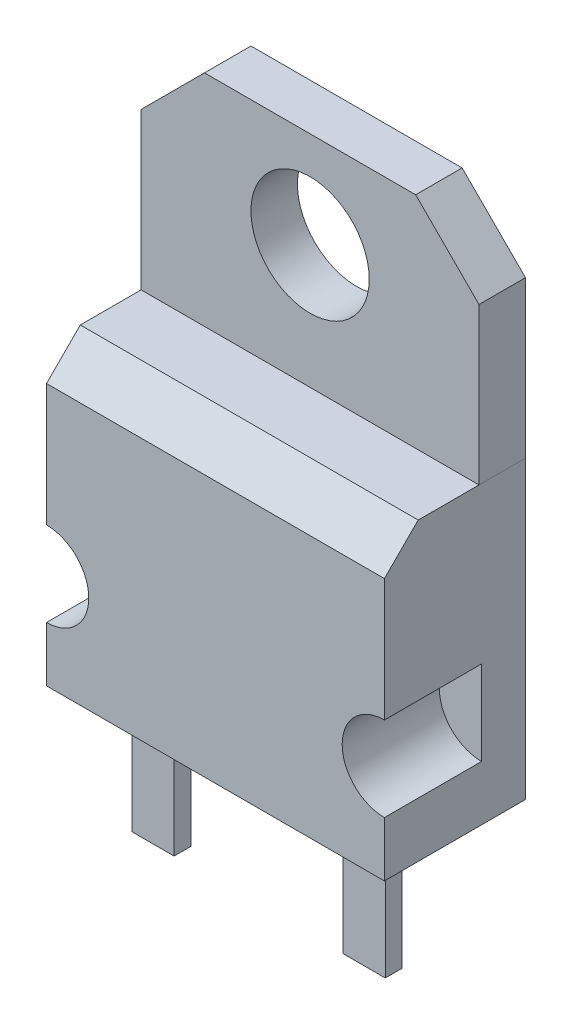
ISO-10303-21;
HEADER;
FILE_DESCRIPTION(('STEP AP214'),'2;1');
FILE_NAME('part.step','',(''),(''),'','','');
FILE_SCHEMA(('AUTOMOTIVE_DESIGN { 1 0 10303 214 1 1 1 1 }'));
ENDSEC;
DATA;
#1=APPLICATION_CONTEXT('core data for automotive mechanical design processes');
#2=APPLICATION_PROTOCOL_DEFINITION('international standard','automotive_design',2000,#1);
#3=PRODUCT_CONTEXT('',#1,'mechanical');
#4=PRODUCT('Part','Part','',(#3));
#5=PRODUCT_RELATED_PRODUCT_CATEGORY('part','',(#4));
#6=PRODUCT_DEFINITION_FORMATION('','',#4);
#7=PRODUCT_DEFINITION_CONTEXT('part definition',#1,'design');
#8=PRODUCT_DEFINITION('design','',#6,#7);
#9=PRODUCT_DEFINITION_SHAPE('','',#8);
#10=(LENGTH_UNIT() NAMED_UNIT(*) SI_UNIT(.MILLI.,.METRE.));
#11=(NAMED_UNIT(*) PLANE_ANGLE_UNIT() SI_UNIT($,.RADIAN.));
#12=(NAMED_UNIT(*) SI_UNIT($,.STERADIAN.) SOLID_ANGLE_UNIT());
#13=UNCERTAINTY_MEASURE_WITH_UNIT(LENGTH_MEASURE(1.E-05),#10,'distance_accuracy_value','');
#14=(GEOMETRIC_REPRESENTATION_CONTEXT(3) GLOBAL_UNCERTAINTY_ASSIGNED_CONTEXT((#13)) GLOBAL_UNIT_ASSIGNED_CONTEXT((#10,
#11,#12)) REPRESENTATION_CONTEXT('',''));
#15=CARTESIAN_POINT('',(0.,0.,0.));
#16=DIRECTION('',(0.,0.,1.));
#17=DIRECTION('',(1.,0.,0.));
#18=AXIS2_PLACEMENT_3D('',#15,#16,#17);
#19=CARTESIAN_POINT('',(3.81,-16.002,2.9464));
#20=DIRECTION('',(-1.,0.,0.));
#21=DIRECTION('',(0.,0.,1.));
#22=AXIS2_PLACEMENT_3D('',#19,#20,#21);
#23=PLANE('',#22);
#24=DIRECTION('',(0.,0.,1.));
#25=VECTOR('',#24,1.);
#26=CARTESIAN_POINT('',(3.81,-12.192,2.9464));
#27=LINE('',#26,#25);
#28=CARTESIAN_POINT('',(3.81,-12.192,2.4384));
#29=VERTEX_POINT('',#28);
#30=CARTESIAN_POINT('',(3.81,-12.192,2.9464));
#31=VERTEX_POINT('',#30);
#32=EDGE_CURVE('E111',#29,#31,#27,.T.);
#33=ORIENTED_EDGE('',*,*,#32,.T.);
#34=DIRECTION('',(0.,1.,0.));
#35=VECTOR('',#34,1.);
#36=CARTESIAN_POINT('',(3.81,-16.002,2.9464));
#37=LINE('',#36,#35);
#38=CARTESIAN_POINT('',(3.81,-16.002,2.9464));
#39=VERTEX_POINT('',#38);
#40=EDGE_CURVE('E12',#39,#31,#37,.T.);
#41=ORIENTED_EDGE('',*,*,#40,.F.);
#42=DIRECTION('',(0.,0.,1.));
#43=VECTOR('',#42,1.);
#44=CARTESIAN_POINT('',(3.81,-16.002,2.9464));
#45=LINE('',#44,#43);
#46=CARTESIAN_POINT('',(3.81,-16.002,2.4384));
#47=VERTEX_POINT('',#46);
#48=EDGE_CURVE('E99',#47,#39,#45,.T.);
#49=ORIENTED_EDGE('',*,*,#48,.F.);
#50=DIRECTION('',(0.,1.,0.));
#51=VECTOR('',#50,1.);
#52=CARTESIAN_POINT('',(3.81,-16.002,2.4384));
#53=LINE('',#52,#51);
#54=EDGE_CURVE('E107',#47,#29,#53,.T.);
#55=ORIENTED_EDGE('',*,*,#54,.T.);
#56=EDGE_LOOP('',(#33,#41,#49,#55));
#57=FACE_BOUND('',#56,.T.);
#58=ADVANCED_FACE('F48',(#57),#23,.F.);
#59=CARTESIAN_POINT('',(2.54,-16.002,2.9464));
#60=DIRECTION('',(0.,0.,-1.));
#61=DIRECTION('',(-1.,0.,0.));
#62=AXIS2_PLACEMENT_3D('',#59,#60,#61);
#63=PLANE('',#62);
#64=DIRECTION('',(-1.,0.,0.));
#65=VECTOR('',#64,1.);
#66=CARTESIAN_POINT('',(2.54,-12.192,2.9464));
#67=LINE('',#66,#65);
#68=CARTESIAN_POINT('',(2.54,-12.192,2.9464));
#69=VERTEX_POINT('',#68);
#70=EDGE_CURVE('E103',#31,#69,#67,.T.);
#71=ORIENTED_EDGE('',*,*,#70,.T.);
#72=DIRECTION('',(0.,1.,0.));
#73=VECTOR('',#72,1.);
#74=CARTESIAN_POINT('',(2.54,-16.002,2.9464));
#75=LINE('',#74,#73);
#76=CARTESIAN_POINT('',(2.54,-16.002,2.9464));
#77=VERTEX_POINT('',#76);
#78=EDGE_CURVE('E56',#77,#69,#75,.T.);
#79=ORIENTED_EDGE('',*,*,#78,.F.);
#80=DIRECTION('',(-1.,0.,0.));
#81=VECTOR('',#80,1.);
#82=CARTESIAN_POINT('',(2.54,-16.002,2.9464));
#83=LINE('',#82,#81);
#84=EDGE_CURVE('E94',#39,#77,#83,.T.);
#85=ORIENTED_EDGE('',*,*,#84,.F.);
#86=ORIENTED_EDGE('',*,*,#40,.T.);
#87=EDGE_LOOP('',(#71,#79,#85,#86));
#88=FACE_BOUND('',#87,.T.);
#89=ADVANCED_FACE('F102',(#88),#63,.F.);
#90=CARTESIAN_POINT('',(2.54,-16.002,2.9464));
#91=DIRECTION('',(1.,0.,0.));
#92=DIRECTION('',(0.,0.,-1.));
#93=AXIS2_PLACEMENT_3D('',#90,#91,#92);
#94=PLANE('',#93);
#95=DIRECTION('',(0.,0.,-1.));
#96=VECTOR('',#95,1.);
#97=CARTESIAN_POINT('',(2.54,-12.192,2.9464));
#98=LINE('',#97,#96);
#99=CARTESIAN_POINT('',(2.54,-12.192,2.4384));
#100=VERTEX_POINT('',#99);
#101=EDGE_CURVE('E81',#69,#100,#98,.T.);
#102=ORIENTED_EDGE('',*,*,#101,.T.);
#103=DIRECTION('',(0.,1.,0.));
#104=VECTOR('',#103,1.);
#105=CARTESIAN_POINT('',(2.54,-16.002,2.4384));
#106=LINE('',#105,#104);
#107=CARTESIAN_POINT('',(2.54,-16.002,2.4384));
#108=VERTEX_POINT('',#107);
#109=EDGE_CURVE('E104',#108,#100,#106,.T.);
#110=ORIENTED_EDGE('',*,*,#109,.F.);
#111=DIRECTION('',(0.,0.,-1.));
#112=VECTOR('',#111,1.);
#113=CARTESIAN_POINT('',(2.54,-16.002,2.9464));
#114=LINE('',#113,#112);
#115=EDGE_CURVE('E97',#77,#108,#114,.T.);
#116=ORIENTED_EDGE('',*,*,#115,.F.);
#117=ORIENTED_EDGE('',*,*,#78,.T.);
#118=EDGE_LOOP('',(#102,#110,#116,#117));
#119=FACE_BOUND('',#118,.T.);
#120=ADVANCED_FACE('F105',(#119),#94,.F.);
#121=CARTESIAN_POINT('',(2.54,-16.002,2.4384));
#122=DIRECTION('',(0.,0.,1.));
#123=DIRECTION('',(1.,0.,0.));
#124=AXIS2_PLACEMENT_3D('',#121,#122,#123);
#125=PLANE('',#124);
#126=DIRECTION('',(1.,0.,0.));
#127=VECTOR('',#126,1.);
#128=CARTESIAN_POINT('',(2.54,-12.192,2.4384));
#129=LINE('',#128,#127);
#130=EDGE_CURVE('E87',#100,#29,#129,.T.);
#131=ORIENTED_EDGE('',*,*,#130,.T.);
#132=ORIENTED_EDGE('',*,*,#54,.F.);
#133=DIRECTION('',(1.,0.,0.));
#134=VECTOR('',#133,1.);
#135=CARTESIAN_POINT('',(2.54,-16.002,2.4384));
#136=LINE('',#135,#134);
#137=EDGE_CURVE('E64',#108,#47,#136,.T.);
#138=ORIENTED_EDGE('',*,*,#137,.F.);
#139=ORIENTED_EDGE('',*,*,#109,.T.);
#140=EDGE_LOOP('',(#131,#132,#138,#139));
#141=FACE_BOUND('',#140,.T.);
#142=ADVANCED_FACE('F118',(#141),#125,.F.);
#143=CARTESIAN_POINT('',(0.,-16.002,0.));
#144=DIRECTION('',(0.,-1.,0.));
#145=DIRECTION('',(0.,0.,-1.));
#146=AXIS2_PLACEMENT_3D('',#143,#144,#145);
#147=PLANE('',#146);
#148=ORIENTED_EDGE('',*,*,#48,.T.);
#149=ORIENTED_EDGE('',*,*,#84,.T.);
#150=ORIENTED_EDGE('',*,*,#115,.T.);
#151=ORIENTED_EDGE('',*,*,#137,.T.);
#152=EDGE_LOOP('',(#148,#149,#150,#151));
#153=FACE_BOUND('',#152,.T.);
#154=ADVANCED_FACE('F95',(#153),#147,.T.);
#155=CARTESIAN_POINT('',(0.,-12.192,0.));
#156=DIRECTION('',(0.,-1.,0.));
#157=DIRECTION('',(0.,0.,-1.));
#158=AXIS2_PLACEMENT_3D('',#155,#156,#157);
#159=PLANE('',#158);
#160=ORIENTED_EDGE('',*,*,#32,.F.);
#161=ORIENTED_EDGE('',*,*,#130,.F.);
#162=ORIENTED_EDGE('',*,*,#101,.F.);
#163=ORIENTED_EDGE('',*,*,#70,.F.);
#164=EDGE_LOOP('',(#160,#161,#162,#163));
#165=FACE_BOUND('',#164,.T.);
#166=ADVANCED_FACE('F121',(#165),#159,.F.);
#167=CLOSED_SHELL('',(#58,#89,#120,#142,#154,#166));
#168=MANIFOLD_SOLID_BREP('B2',#167);
#169=CARTESIAN_POINT('',(-2.54,-16.002,2.9464));
#170=DIRECTION('',(-1.,0.,0.));
#171=DIRECTION('',(0.,0.,1.));
#172=AXIS2_PLACEMENT_3D('',#169,#170,#171);
#173=PLANE('',#172);
#174=DIRECTION('',(0.,0.,1.));
#175=VECTOR('',#174,1.);
#176=CARTESIAN_POINT('',(-2.54,-12.192,2.9464));
#177=LINE('',#176,#175);
#178=CARTESIAN_POINT('',(-2.54,-12.192,2.4384));
#179=VERTEX_POINT('',#178);
#180=CARTESIAN_POINT('',(-2.54,-12.192,2.9464));
#181=VERTEX_POINT('',#180);
#182=EDGE_CURVE('E245',#179,#181,#177,.T.);
#183=ORIENTED_EDGE('',*,*,#182,.T.);
#184=DIRECTION('',(0.,1.,0.));
#185=VECTOR('',#184,1.);
#186=CARTESIAN_POINT('',(-2.54,-16.002,2.9464));
#187=LINE('',#186,#185);
#188=CARTESIAN_POINT('',(-2.54,-16.002,2.9464));
#189=VERTEX_POINT('',#188);
#190=EDGE_CURVE('E46',#189,#181,#187,.T.);
#191=ORIENTED_EDGE('',*,*,#190,.F.);
#192=DIRECTION('',(0.,0.,1.));
#193=VECTOR('',#192,1.);
#194=CARTESIAN_POINT('',(-2.54,-16.002,2.9464));
#195=LINE('',#194,#193);
#196=CARTESIAN_POINT('',(-2.54,-16.002,2.4384));
#197=VERTEX_POINT('',#196);
#198=EDGE_CURVE('E233',#197,#189,#195,.T.);
#199=ORIENTED_EDGE('',*,*,#198,.F.);
#200=DIRECTION('',(0.,1.,0.));
#201=VECTOR('',#200,1.);
#202=CARTESIAN_POINT('',(-2.54,-16.002,2.4384));
#203=LINE('',#202,#201);
#204=EDGE_CURVE('E241',#197,#179,#203,.T.);
#205=ORIENTED_EDGE('',*,*,#204,.T.);
#206=EDGE_LOOP('',(#183,#191,#199,#205));
#207=FACE_BOUND('',#206,.T.);
#208=ADVANCED_FACE('F182',(#207),#173,.F.);
#209=CARTESIAN_POINT('',(-3.81,-16.002,2.9464));
#210=DIRECTION('',(0.,0.,-1.));
#211=DIRECTION('',(-1.,0.,0.));
#212=AXIS2_PLACEMENT_3D('',#209,#210,#211);
#213=PLANE('',#212);
#214=DIRECTION('',(-1.,0.,0.));
#215=VECTOR('',#214,1.);
#216=CARTESIAN_POINT('',(-3.81,-12.192,2.9464));
#217=LINE('',#216,#215);
#218=CARTESIAN_POINT('',(-3.81,-12.192,2.9464));
#219=VERTEX_POINT('',#218);
#220=EDGE_CURVE('E237',#181,#219,#217,.T.);
#221=ORIENTED_EDGE('',*,*,#220,.T.);
#222=DIRECTION('',(0.,1.,0.));
#223=VECTOR('',#222,1.);
#224=CARTESIAN_POINT('',(-3.81,-16.002,2.9464));
#225=LINE('',#224,#223);
#226=CARTESIAN_POINT('',(-3.81,-16.002,2.9464));
#227=VERTEX_POINT('',#226);
#228=EDGE_CURVE('E190',#227,#219,#225,.T.);
#229=ORIENTED_EDGE('',*,*,#228,.F.);
#230=DIRECTION('',(-1.,0.,0.));
#231=VECTOR('',#230,1.);
#232=CARTESIAN_POINT('',(-3.81,-16.002,2.9464));
#233=LINE('',#232,#231);
#234=EDGE_CURVE('E228',#189,#227,#233,.T.);
#235=ORIENTED_EDGE('',*,*,#234,.F.);
#236=ORIENTED_EDGE('',*,*,#190,.T.);
#237=EDGE_LOOP('',(#221,#229,#235,#236));
#238=FACE_BOUND('',#237,.T.);
#239=ADVANCED_FACE('F236',(#238),#213,.F.);
#240=CARTESIAN_POINT('',(-3.81,-16.002,2.9464));
#241=DIRECTION('',(1.,0.,0.));
#242=DIRECTION('',(0.,0.,-1.));
#243=AXIS2_PLACEMENT_3D('',#240,#241,#242);
#244=PLANE('',#243);
#245=DIRECTION('',(0.,0.,-1.));
#246=VECTOR('',#245,1.);
#247=CARTESIAN_POINT('',(-3.81,-12.192,2.9464));
#248=LINE('',#247,#246);
#249=CARTESIAN_POINT('',(-3.81,-12.192,2.4384));
#250=VERTEX_POINT('',#249);
#251=EDGE_CURVE('E215',#219,#250,#248,.T.);
#252=ORIENTED_EDGE('',*,*,#251,.T.);
#253=DIRECTION('',(0.,1.,0.));
#254=VECTOR('',#253,1.);
#255=CARTESIAN_POINT('',(-3.81,-16.002,2.4384));
#256=LINE('',#255,#254);
#257=CARTESIAN_POINT('',(-3.81,-16.002,2.4384));
#258=VERTEX_POINT('',#257);
#259=EDGE_CURVE('E238',#258,#250,#256,.T.);
#260=ORIENTED_EDGE('',*,*,#259,.F.);
#261=DIRECTION('',(0.,0.,-1.));
#262=VECTOR('',#261,1.);
#263=CARTESIAN_POINT('',(-3.81,-16.002,2.9464));
#264=LINE('',#263,#262);
#265=EDGE_CURVE('E231',#227,#258,#264,.T.);
#266=ORIENTED_EDGE('',*,*,#265,.F.);
#267=ORIENTED_EDGE('',*,*,#228,.T.);
#268=EDGE_LOOP('',(#252,#260,#266,#267));
#269=FACE_BOUND('',#268,.T.);
#270=ADVANCED_FACE('F239',(#269),#244,.F.);
#271=CARTESIAN_POINT('',(-3.81,-16.002,2.4384));
#272=DIRECTION('',(0.,0.,1.));
#273=DIRECTION('',(1.,0.,0.));
#274=AXIS2_PLACEMENT_3D('',#271,#272,#273);
#275=PLANE('',#274);
#276=DIRECTION('',(1.,0.,0.));
#277=VECTOR('',#276,1.);
#278=CARTESIAN_POINT('',(-3.81,-12.192,2.4384));
#279=LINE('',#278,#277);
#280=EDGE_CURVE('E221',#250,#179,#279,.T.);
#281=ORIENTED_EDGE('',*,*,#280,.T.);
#282=ORIENTED_EDGE('',*,*,#204,.F.);
#283=DIRECTION('',(1.,0.,0.));
#284=VECTOR('',#283,1.);
#285=CARTESIAN_POINT('',(-3.81,-16.002,2.4384));
#286=LINE('',#285,#284);
#287=EDGE_CURVE('E198',#258,#197,#286,.T.);
#288=ORIENTED_EDGE('',*,*,#287,.F.);
#289=ORIENTED_EDGE('',*,*,#259,.T.);
#290=EDGE_LOOP('',(#281,#282,#288,#289));
#291=FACE_BOUND('',#290,.T.);
#292=ADVANCED_FACE('F252',(#291),#275,.F.);
#293=CARTESIAN_POINT('',(0.,-16.002,0.));
#294=DIRECTION('',(0.,-1.,0.));
#295=DIRECTION('',(0.,0.,-1.));
#296=AXIS2_PLACEMENT_3D('',#293,#294,#295);
#297=PLANE('',#296);
#298=ORIENTED_EDGE('',*,*,#198,.T.);
#299=ORIENTED_EDGE('',*,*,#234,.T.);
#300=ORIENTED_EDGE('',*,*,#265,.T.);
#301=ORIENTED_EDGE('',*,*,#287,.T.);
#302=EDGE_LOOP('',(#298,#299,#300,#301));
#303=FACE_BOUND('',#302,.T.);
#304=ADVANCED_FACE('F229',(#303),#297,.T.);
#305=CARTESIAN_POINT('',(0.,-12.192,0.));
#306=DIRECTION('',(0.,-1.,0.));
#307=DIRECTION('',(0.,0.,-1.));
#308=AXIS2_PLACEMENT_3D('',#305,#306,#307);
#309=PLANE('',#308);
#310=ORIENTED_EDGE('',*,*,#182,.F.);
#311=ORIENTED_EDGE('',*,*,#280,.F.);
#312=ORIENTED_EDGE('',*,*,#251,.F.);
#313=ORIENTED_EDGE('',*,*,#220,.F.);
#314=EDGE_LOOP('',(#310,#311,#312,#313));
#315=FACE_BOUND('',#314,.T.);
#316=ADVANCED_FACE('F255',(#315),#309,.F.);
#317=CLOSED_SHELL('',(#208,#239,#270,#292,#304,#316));
#318=MANIFOLD_SOLID_BREP('B6',#317);
#319=CARTESIAN_POINT('',(5.08,-3.302,4.2418));
#320=DIRECTION('',(-1.,0.,0.));
#321=DIRECTION('',(0.,0.,1.));
#322=AXIS2_PLACEMENT_3D('',#319,#320,#321);
#323=PLANE('',#322);
#324=DIRECTION('',(0.,1.,0.));
#325=VECTOR('',#324,1.);
#326=CARTESIAN_POINT('',(5.08,-3.302,1.3208));
#327=LINE('',#326,#325);
#328=CARTESIAN_POINT('',(5.08,-10.541,1.3208));
#329=VERTEX_POINT('',#328);
#330=CARTESIAN_POINT('',(5.08,-8.001,1.3208));
#331=VERTEX_POINT('',#330);
#332=EDGE_CURVE('E180',#329,#331,#327,.T.);
#333=ORIENTED_EDGE('',*,*,#332,.F.);
#334=DIRECTION('',(0.,0.,1.));
#335=VECTOR('',#334,1.);
#336=CARTESIAN_POINT('',(5.08,-10.541,1.3208));
#337=LINE('',#336,#335);
#338=CARTESIAN_POINT('',(5.08,-10.541,4.2418));
#339=VERTEX_POINT('',#338);
#340=EDGE_CURVE('E486',#329,#339,#337,.T.);
#341=ORIENTED_EDGE('',*,*,#340,.T.);
#342=DIRECTION('',(0.,1.,0.));
#343=VECTOR('',#342,1.);
#344=CARTESIAN_POINT('',(5.08,-3.302,4.2418));
#345=LINE('',#344,#343);
#346=CARTESIAN_POINT('',(5.08,-12.192,4.2418));
#347=VERTEX_POINT('',#346);
#348=EDGE_CURVE('E465',#347,#339,#345,.T.);
#349=ORIENTED_EDGE('',*,*,#348,.F.);
#350=DIRECTION('',(0.,0.,-1.));
#351=VECTOR('',#350,1.);
#352=CARTESIAN_POINT('',(5.08,-12.192,4.2418));
#353=LINE('',#352,#351);
#354=CARTESIAN_POINT('',(5.08,-12.192,0.));
#355=VERTEX_POINT('',#354);
#356=EDGE_CURVE('E444',#347,#355,#353,.T.);
#357=ORIENTED_EDGE('',*,*,#356,.T.);
#358=DIRECTION('',(0.,1.,0.));
#359=VECTOR('',#358,1.);
#360=CARTESIAN_POINT('',(5.08,-3.302,0.));
#361=LINE('',#360,#359);
#362=CARTESIAN_POINT('',(5.08,-3.302,0.));
#363=VERTEX_POINT('',#362);
#364=EDGE_CURVE('E457',#355,#363,#361,.T.);
#365=ORIENTED_EDGE('',*,*,#364,.T.);
#366=DIRECTION('',(0.,0.,-1.));
#367=VECTOR('',#366,1.);
#368=CARTESIAN_POINT('',(5.08,-3.302,4.2418));
#369=LINE('',#368,#367);
#370=CARTESIAN_POINT('',(5.08,-3.302,3.2258));
#371=VERTEX_POINT('',#370);
#372=EDGE_CURVE('E437',#371,#363,#369,.T.);
#373=ORIENTED_EDGE('',*,*,#372,.F.);
#374=DIRECTION('',(0.,-0.707106781186546,0.707106781186549));
#375=VECTOR('',#374,1.);
#376=CARTESIAN_POINT('',(5.08,-4.318,4.2418));
#377=LINE('',#376,#375);
#378=CARTESIAN_POINT('',(5.08,-4.318,4.2418));
#379=VERTEX_POINT('',#378);
#380=EDGE_CURVE('E425',#371,#379,#377,.T.);
#381=ORIENTED_EDGE('',*,*,#380,.T.);
#382=CARTESIAN_POINT('',(5.08,-8.001,4.2418));
#383=VERTEX_POINT('',#382);
#384=EDGE_CURVE('E450',#383,#379,#345,.T.);
#385=ORIENTED_EDGE('',*,*,#384,.F.);
#386=DIRECTION('',(0.,0.,1.));
#387=VECTOR('',#386,1.);
#388=CARTESIAN_POINT('',(5.08,-8.001,1.3208));
#389=LINE('',#388,#387);
#390=EDGE_CURVE('E338',#383,#331,#389,.F.);
#391=ORIENTED_EDGE('',*,*,#390,.T.);
#392=EDGE_LOOP('',(#333,#341,#349,#357,#365,#373,#381,#385,#391));
#393=FACE_BOUND('',#392,.T.);
#394=ADVANCED_FACE('F315',(#393),#323,.F.);
#395=CARTESIAN_POINT('',(-5.08,-3.302,4.2418));
#396=DIRECTION('',(0.,-1.,0.));
#397=DIRECTION('',(0.,0.,-1.));
#398=AXIS2_PLACEMENT_3D('',#395,#396,#397);
#399=PLANE('',#398);
#400=DIRECTION('',(0.,0.,-1.));
#401=VECTOR('',#400,1.);
#402=CARTESIAN_POINT('',(-5.08,-3.302,4.2418));
#403=LINE('',#402,#401);
#404=CARTESIAN_POINT('',(-5.08,-3.302,3.2258));
#405=VERTEX_POINT('',#404);
#406=CARTESIAN_POINT('',(-5.08,-3.302,0.));
#407=VERTEX_POINT('',#406);
#408=EDGE_CURVE('E439',#405,#407,#403,.T.);
#409=ORIENTED_EDGE('',*,*,#408,.F.);
#410=DIRECTION('',(1.,0.,0.));
#411=VECTOR('',#410,1.);
#412=CARTESIAN_POINT('',(5.08,-3.302,3.2258));
#413=LINE('',#412,#411);
#414=EDGE_CURVE('E430',#405,#371,#413,.T.);
#415=ORIENTED_EDGE('',*,*,#414,.T.);
#416=ORIENTED_EDGE('',*,*,#372,.T.);
#417=DIRECTION('',(-1.,0.,0.));
#418=VECTOR('',#417,1.);
#419=CARTESIAN_POINT('',(-5.08,-3.302,0.));
#420=LINE('',#419,#418);
#421=CARTESIAN_POINT('',(3.81,-3.302,0.));
#422=VERTEX_POINT('',#421);
#423=EDGE_CURVE('E453',#363,#422,#420,.T.);
#424=ORIENTED_EDGE('',*,*,#423,.T.);
#425=DIRECTION('',(0.,0.,-1.));
#426=VECTOR('',#425,1.);
#427=CARTESIAN_POINT('',(3.81,-3.302,1.397));
#428=LINE('',#427,#426);
#429=CARTESIAN_POINT('',(3.81,-3.302,1.397));
#430=VERTEX_POINT('',#429);
#431=EDGE_CURVE('E460',#430,#422,#428,.T.);
#432=ORIENTED_EDGE('',*,*,#431,.F.);
#433=DIRECTION('',(1.,0.,0.));
#434=VECTOR('',#433,1.);
#435=CARTESIAN_POINT('',(3.81,-3.302,1.397));
#436=LINE('',#435,#434);
#437=CARTESIAN_POINT('',(-3.81,-3.302,1.397));
#438=VERTEX_POINT('',#437);
#439=EDGE_CURVE('E472',#438,#430,#436,.T.);
#440=ORIENTED_EDGE('',*,*,#439,.F.);
#441=DIRECTION('',(0.,0.,-1.));
#442=VECTOR('',#441,1.);
#443=CARTESIAN_POINT('',(-3.81,-3.302,1.397));
#444=LINE('',#443,#442);
#445=CARTESIAN_POINT('',(-3.81,-3.302,0.));
#446=VERTEX_POINT('',#445);
#447=EDGE_CURVE('E474',#438,#446,#444,.T.);
#448=ORIENTED_EDGE('',*,*,#447,.T.);
#449=EDGE_CURVE('E456',#446,#407,#420,.T.);
#450=ORIENTED_EDGE('',*,*,#449,.T.);
#451=EDGE_LOOP('',(#409,#415,#416,#424,#432,#440,#448,#450));
#452=FACE_BOUND('',#451,.T.);
#453=ADVANCED_FACE('F524',(#452),#399,.F.);
#454=CARTESIAN_POINT('',(-5.08,-3.302,4.2418));
#455=DIRECTION('',(1.,0.,0.));
#456=DIRECTION('',(0.,1.,0.));
#457=AXIS2_PLACEMENT_3D('',#454,#455,#456);
#458=PLANE('',#457);
#459=DIRECTION('',(0.,-1.,0.));
#460=VECTOR('',#459,1.);
#461=CARTESIAN_POINT('',(-5.08,-3.302,1.3208));
#462=LINE('',#461,#460);
#463=CARTESIAN_POINT('',(-5.08,-8.001,1.3208));
#464=VERTEX_POINT('',#463);
#465=CARTESIAN_POINT('',(-5.08,-10.541,1.3208));
#466=VERTEX_POINT('',#465);
#467=EDGE_CURVE('E323',#464,#466,#462,.T.);
#468=ORIENTED_EDGE('',*,*,#467,.F.);
#469=DIRECTION('',(0.,0.,1.));
#470=VECTOR('',#469,1.);
#471=CARTESIAN_POINT('',(-5.08,-8.001,1.3208));
#472=LINE('',#471,#470);
#473=CARTESIAN_POINT('',(-5.08,-8.001,4.2418));
#474=VERTEX_POINT('',#473);
#475=EDGE_CURVE('E409',#464,#474,#472,.T.);
#476=ORIENTED_EDGE('',*,*,#475,.T.);
#477=DIRECTION('',(0.,-1.,0.));
#478=VECTOR('',#477,1.);
#479=CARTESIAN_POINT('',(-5.08,-3.302,4.2418));
#480=LINE('',#479,#478);
#481=CARTESIAN_POINT('',(-5.08,-4.318,4.2418));
#482=VERTEX_POINT('',#481);
#483=EDGE_CURVE('E462',#482,#474,#480,.T.);
#484=ORIENTED_EDGE('',*,*,#483,.F.);
#485=DIRECTION('',(0.,0.707106781186546,-0.707106781186549));
#486=VECTOR('',#485,1.);
#487=CARTESIAN_POINT('',(-5.08,-4.318,4.2418));
#488=LINE('',#487,#486);
#489=EDGE_CURVE('E432',#482,#405,#488,.T.);
#490=ORIENTED_EDGE('',*,*,#489,.T.);
#491=ORIENTED_EDGE('',*,*,#408,.T.);
#492=DIRECTION('',(0.,-1.,0.));
#493=VECTOR('',#492,1.);
#494=CARTESIAN_POINT('',(-5.08,-3.302,0.));
#495=LINE('',#494,#493);
#496=CARTESIAN_POINT('',(-5.08,-12.192,0.));
#497=VERTEX_POINT('',#496);
#498=EDGE_CURVE('E451',#407,#497,#495,.T.);
#499=ORIENTED_EDGE('',*,*,#498,.T.);
#500=DIRECTION('',(0.,0.,-1.));
#501=VECTOR('',#500,1.);
#502=CARTESIAN_POINT('',(-5.08,-12.192,4.2418));
#503=LINE('',#502,#501);
#504=CARTESIAN_POINT('',(-5.08,-12.192,4.2418));
#505=VERTEX_POINT('',#504);
#506=EDGE_CURVE('E441',#505,#497,#503,.T.);
#507=ORIENTED_EDGE('',*,*,#506,.F.);
#508=CARTESIAN_POINT('',(-5.08,-10.541,4.2418));
#509=VERTEX_POINT('',#508);
#510=EDGE_CURVE('E464',#509,#505,#480,.T.);
#511=ORIENTED_EDGE('',*,*,#510,.F.);
#512=DIRECTION('',(0.,0.,1.));
#513=VECTOR('',#512,1.);
#514=CARTESIAN_POINT('',(-5.08,-10.541,1.3208));
#515=LINE('',#514,#513);
#516=EDGE_CURVE('E330',#509,#466,#515,.F.);
#517=ORIENTED_EDGE('',*,*,#516,.T.);
#518=EDGE_LOOP('',(#468,#476,#484,#490,#491,#499,#507,#511,#517));
#519=FACE_BOUND('',#518,.T.);
#520=ADVANCED_FACE('F423',(#519),#458,.F.);
#521=CARTESIAN_POINT('',(-5.08,-12.192,4.2418));
#522=DIRECTION('',(0.,1.,0.));
#523=DIRECTION('',(0.,0.,1.));
#524=AXIS2_PLACEMENT_3D('',#521,#522,#523);
#525=PLANE('',#524);
#526=DIRECTION('',(1.,0.,0.));
#527=VECTOR('',#526,1.);
#528=CARTESIAN_POINT('',(-5.08,-12.192,0.));
#529=LINE('',#528,#527);
#530=EDGE_CURVE('E448',#497,#355,#529,.T.);
#531=ORIENTED_EDGE('',*,*,#530,.T.);
#532=ORIENTED_EDGE('',*,*,#356,.F.);
#533=DIRECTION('',(1.,0.,0.));
#534=VECTOR('',#533,1.);
#535=CARTESIAN_POINT('',(-5.08,-12.192,4.2418));
#536=LINE('',#535,#534);
#537=EDGE_CURVE('E447',#505,#347,#536,.T.);
#538=ORIENTED_EDGE('',*,*,#537,.F.);
#539=ORIENTED_EDGE('',*,*,#506,.T.);
#540=EDGE_LOOP('',(#531,#532,#538,#539));
#541=FACE_BOUND('',#540,.T.);
#542=ADVANCED_FACE('F533',(#541),#525,.F.);
#543=CARTESIAN_POINT('',(0.,0.,4.2418));
#544=DIRECTION('',(0.,0.,1.));
#545=DIRECTION('',(1.,0.,0.));
#546=AXIS2_PLACEMENT_3D('',#543,#544,#545);
#547=PLANE('',#546);
#548=CARTESIAN_POINT('',(5.08,-9.271,4.2418));
#549=DIRECTION('',(0.,0.,1.));
#550=DIRECTION('',(1.,0.,0.));
#551=AXIS2_PLACEMENT_3D('',#548,#549,#550);
#552=CIRCLE('',#551,1.27);
#553=EDGE_CURVE('E421',#383,#339,#552,.T.);
#554=ORIENTED_EDGE('',*,*,#553,.F.);
#555=ORIENTED_EDGE('',*,*,#384,.T.);
#556=DIRECTION('',(-1.,0.,0.));
#557=VECTOR('',#556,1.);
#558=CARTESIAN_POINT('',(-5.08,-4.318,4.2418));
#559=LINE('',#558,#557);
#560=EDGE_CURVE('E434',#379,#482,#559,.T.);
#561=ORIENTED_EDGE('',*,*,#560,.T.);
#562=ORIENTED_EDGE('',*,*,#483,.T.);
#563=CARTESIAN_POINT('',(-5.08,-9.271,4.2418));
#564=DIRECTION('',(0.,0.,1.));
#565=DIRECTION('',(1.,0.,0.));
#566=AXIS2_PLACEMENT_3D('',#563,#564,#565);
#567=CIRCLE('',#566,1.27);
#568=EDGE_CURVE('E413',#509,#474,#567,.T.);
#569=ORIENTED_EDGE('',*,*,#568,.F.);
#570=ORIENTED_EDGE('',*,*,#510,.T.);
#571=ORIENTED_EDGE('',*,*,#537,.T.);
#572=ORIENTED_EDGE('',*,*,#348,.T.);
#573=EDGE_LOOP('',(#554,#555,#561,#562,#569,#570,#571,#572));
#574=FACE_BOUND('',#573,.T.);
#575=ADVANCED_FACE('F514',(#574),#547,.T.);
#576=CARTESIAN_POINT('',(0.,0.,0.));
#577=DIRECTION('',(0.,0.,1.));
#578=DIRECTION('',(1.,0.,0.));
#579=AXIS2_PLACEMENT_3D('',#576,#577,#578);
#580=PLANE('',#579);
#581=DIRECTION('',(-1.,0.,0.));
#582=VECTOR('',#581,1.);
#583=CARTESIAN_POINT('',(3.81,-9.144,0.));
#584=LINE('',#583,#582);
#585=CARTESIAN_POINT('',(3.81,-9.144,0.));
#586=VERTEX_POINT('',#585);
#587=CARTESIAN_POINT('',(-3.81,-9.144,0.));
#588=VERTEX_POINT('',#587);
#589=EDGE_CURVE('E481',#586,#588,#584,.T.);
#590=ORIENTED_EDGE('',*,*,#589,.F.);
#591=DIRECTION('',(0.,-1.,0.));
#592=VECTOR('',#591,1.);
#593=CARTESIAN_POINT('',(3.81,-3.302,0.));
#594=LINE('',#593,#592);
#595=EDGE_CURVE('E484',#422,#586,#594,.T.);
#596=ORIENTED_EDGE('',*,*,#595,.F.);
#597=ORIENTED_EDGE('',*,*,#423,.F.);
#598=ORIENTED_EDGE('',*,*,#364,.F.);
#599=ORIENTED_EDGE('',*,*,#530,.F.);
#600=ORIENTED_EDGE('',*,*,#498,.F.);
#601=ORIENTED_EDGE('',*,*,#449,.F.);
#602=DIRECTION('',(0.,1.,0.));
#603=VECTOR('',#602,1.);
#604=CARTESIAN_POINT('',(-3.81,-3.302,0.));
#605=LINE('',#604,#603);
#606=EDGE_CURVE('E478',#588,#446,#605,.T.);
#607=ORIENTED_EDGE('',*,*,#606,.F.);
#608=EDGE_LOOP('',(#590,#596,#597,#598,#599,#600,#601,#607));
#609=FACE_BOUND('',#608,.T.);
#610=ADVANCED_FACE('F537',(#609),#580,.F.);
#611=CARTESIAN_POINT('',(3.81,-3.302,1.397));
#612=DIRECTION('',(1.,0.,0.));
#613=DIRECTION('',(0.,0.,-1.));
#614=AXIS2_PLACEMENT_3D('',#611,#612,#613);
#615=PLANE('',#614);
#616=ORIENTED_EDGE('',*,*,#595,.T.);
#617=DIRECTION('',(0.,0.,-1.));
#618=VECTOR('',#617,1.);
#619=CARTESIAN_POINT('',(3.81,-9.144,1.397));
#620=LINE('',#619,#618);
#621=CARTESIAN_POINT('',(3.81,-9.144,1.397));
#622=VERTEX_POINT('',#621);
#623=EDGE_CURVE('E468',#622,#586,#620,.T.);
#624=ORIENTED_EDGE('',*,*,#623,.F.);
#625=DIRECTION('',(0.,-1.,0.));
#626=VECTOR('',#625,1.);
#627=CARTESIAN_POINT('',(3.81,-3.302,1.397));
#628=LINE('',#627,#626);
#629=EDGE_CURVE('E480',#430,#622,#628,.T.);
#630=ORIENTED_EDGE('',*,*,#629,.F.);
#631=ORIENTED_EDGE('',*,*,#431,.T.);
#632=EDGE_LOOP('',(#616,#624,#630,#631));
#633=FACE_BOUND('',#632,.T.);
#634=ADVANCED_FACE('F540',(#633),#615,.F.);
#635=CARTESIAN_POINT('',(-3.81,-3.302,1.397));
#636=DIRECTION('',(-1.,0.,0.));
#637=DIRECTION('',(0.,0.,1.));
#638=AXIS2_PLACEMENT_3D('',#635,#636,#637);
#639=PLANE('',#638);
#640=ORIENTED_EDGE('',*,*,#606,.T.);
#641=ORIENTED_EDGE('',*,*,#447,.F.);
#642=DIRECTION('',(0.,1.,0.));
#643=VECTOR('',#642,1.);
#644=CARTESIAN_POINT('',(-3.81,-3.302,1.397));
#645=LINE('',#644,#643);
#646=CARTESIAN_POINT('',(-3.81,-9.144,1.397));
#647=VERTEX_POINT('',#646);
#648=EDGE_CURVE('E489',#647,#438,#645,.T.);
#649=ORIENTED_EDGE('',*,*,#648,.F.);
#650=DIRECTION('',(0.,0.,-1.));
#651=VECTOR('',#650,1.);
#652=CARTESIAN_POINT('',(-3.81,-9.144,1.397));
#653=LINE('',#652,#651);
#654=EDGE_CURVE('E471',#647,#588,#653,.T.);
#655=ORIENTED_EDGE('',*,*,#654,.T.);
#656=EDGE_LOOP('',(#640,#641,#649,#655));
#657=FACE_BOUND('',#656,.T.);
#658=ADVANCED_FACE('F546',(#657),#639,.F.);
#659=CARTESIAN_POINT('',(3.81,-9.144,1.397));
#660=DIRECTION('',(0.,-1.,0.));
#661=DIRECTION('',(0.,0.,-1.));
#662=AXIS2_PLACEMENT_3D('',#659,#660,#661);
#663=PLANE('',#662);
#664=ORIENTED_EDGE('',*,*,#589,.T.);
#665=ORIENTED_EDGE('',*,*,#654,.F.);
#666=DIRECTION('',(-1.,0.,0.));
#667=VECTOR('',#666,1.);
#668=CARTESIAN_POINT('',(3.81,-9.144,1.397));
#669=LINE('',#668,#667);
#670=EDGE_CURVE('E492',#622,#647,#669,.T.);
#671=ORIENTED_EDGE('',*,*,#670,.F.);
#672=ORIENTED_EDGE('',*,*,#623,.T.);
#673=EDGE_LOOP('',(#664,#665,#671,#672));
#674=FACE_BOUND('',#673,.T.);
#675=ADVANCED_FACE('F548',(#674),#663,.F.);
#676=CARTESIAN_POINT('',(0.,0.,1.397));
#677=DIRECTION('',(0.,0.,-1.));
#678=DIRECTION('',(-1.,0.,0.));
#679=AXIS2_PLACEMENT_3D('',#676,#677,#678);
#680=PLANE('',#679);
#681=ORIENTED_EDGE('',*,*,#629,.T.);
#682=ORIENTED_EDGE('',*,*,#670,.T.);
#683=ORIENTED_EDGE('',*,*,#648,.T.);
#684=ORIENTED_EDGE('',*,*,#439,.T.);
#685=EDGE_LOOP('',(#681,#682,#683,#684));
#686=FACE_BOUND('',#685,.T.);
#687=ADVANCED_FACE('F551',(#686),#680,.T.);
#688=CARTESIAN_POINT('',(0.,-4.318,4.2418));
#689=DIRECTION('',(0.,0.707106781186549,0.707106781186546));
#690=DIRECTION('',(1.,0.,0.));
#691=AXIS2_PLACEMENT_3D('',#688,#689,#690);
#692=PLANE('',#691);
#693=ORIENTED_EDGE('',*,*,#380,.F.);
#694=ORIENTED_EDGE('',*,*,#414,.F.);
#695=ORIENTED_EDGE('',*,*,#489,.F.);
#696=ORIENTED_EDGE('',*,*,#560,.F.);
#697=EDGE_LOOP('',(#693,#694,#695,#696));
#698=FACE_BOUND('',#697,.T.);
#699=ADVANCED_FACE('F317',(#698),#692,.T.);
#700=CARTESIAN_POINT('',(-5.08,-9.271,1.3208));
#701=DIRECTION('',(0.,0.,1.));
#702=DIRECTION('',(1.,0.,0.));
#703=AXIS2_PLACEMENT_3D('',#700,#701,#702);
#704=PLANE('',#703);
#705=ORIENTED_EDGE('',*,*,#467,.T.);
#706=CARTESIAN_POINT('',(-5.08,-9.271,1.3208));
#707=DIRECTION('',(0.,0.,1.));
#708=DIRECTION('',(1.,0.,0.));
#709=AXIS2_PLACEMENT_3D('',#706,#707,#708);
#710=CIRCLE('',#709,1.27);
#711=EDGE_CURVE('E412',#466,#464,#710,.T.);
#712=ORIENTED_EDGE('',*,*,#711,.T.);
#713=EDGE_LOOP('',(#705,#712));
#714=FACE_BOUND('',#713,.T.);
#715=ADVANCED_FACE('F420',(#714),#704,.T.);
#716=CARTESIAN_POINT('',(-5.08,-9.271,1.3208));
#717=DIRECTION('',(0.,0.,1.));
#718=DIRECTION('',(1.,0.,0.));
#719=AXIS2_PLACEMENT_3D('',#716,#717,#718);
#720=CYLINDRICAL_SURFACE('',#719,1.27);
#721=ORIENTED_EDGE('',*,*,#711,.F.);
#722=ORIENTED_EDGE('',*,*,#516,.F.);
#723=ORIENTED_EDGE('',*,*,#568,.T.);
#724=ORIENTED_EDGE('',*,*,#475,.F.);
#725=EDGE_LOOP('',(#721,#722,#723,#724));
#726=FACE_BOUND('',#725,.T.);
#727=ADVANCED_FACE('F411',(#726),#720,.F.);
#728=CARTESIAN_POINT('',(5.08,-9.271,1.3208));
#729=DIRECTION('',(0.,0.,1.));
#730=DIRECTION('',(1.,0.,0.));
#731=AXIS2_PLACEMENT_3D('',#728,#729,#730);
#732=PLANE('',#731);
#733=ORIENTED_EDGE('',*,*,#332,.T.);
#734=CARTESIAN_POINT('',(5.08,-9.271,1.3208));
#735=DIRECTION('',(0.,0.,1.));
#736=DIRECTION('',(1.,0.,0.));
#737=AXIS2_PLACEMENT_3D('',#734,#735,#736);
#738=CIRCLE('',#737,1.27);
#739=EDGE_CURVE('E500',#331,#329,#738,.T.);
#740=ORIENTED_EDGE('',*,*,#739,.T.);
#741=EDGE_LOOP('',(#733,#740));
#742=FACE_BOUND('',#741,.T.);
#743=ADVANCED_FACE('F506',(#742),#732,.T.);
#744=CARTESIAN_POINT('',(5.08,-9.271,1.3208));
#745=DIRECTION('',(0.,0.,1.));
#746=DIRECTION('',(1.,0.,0.));
#747=AXIS2_PLACEMENT_3D('',#744,#745,#746);
#748=CYLINDRICAL_SURFACE('',#747,1.27);
#749=ORIENTED_EDGE('',*,*,#739,.F.);
#750=ORIENTED_EDGE('',*,*,#390,.F.);
#751=ORIENTED_EDGE('',*,*,#553,.T.);
#752=ORIENTED_EDGE('',*,*,#340,.F.);
#753=EDGE_LOOP('',(#749,#750,#751,#752));
#754=FACE_BOUND('',#753,.T.);
#755=ADVANCED_FACE('F515',(#754),#748,.F.);
#756=CLOSED_SHELL('',(#394,#453,#520,#542,#575,#610,#634,#658,#675,#687,#699,#715,#727,#743,#755));
#757=MANIFOLD_SOLID_BREP('B40',#756);
#758=CARTESIAN_POINT('',(5.08,0.,1.397));
#759=DIRECTION('',(1.,0.,0.));
#760=DIRECTION('',(0.,0.,-1.));
#761=AXIS2_PLACEMENT_3D('',#758,#759,#760);
#762=PLANE('',#761);
#763=DIRECTION('',(0.,-1.,0.));
#764=VECTOR('',#763,1.);
#765=CARTESIAN_POINT('',(5.08,0.,0.));
#766=LINE('',#765,#764);
#767=CARTESIAN_POINT('',(5.08,1.39699999999999,0.));
#768=VERTEX_POINT('',#767);
#769=CARTESIAN_POINT('',(5.08,-3.302,0.));
#770=VERTEX_POINT('',#769);
#771=EDGE_CURVE('E789',#768,#770,#766,.T.);
#772=ORIENTED_EDGE('',*,*,#771,.F.);
#773=DIRECTION('',(0.,0.,1.));
#774=VECTOR('',#773,1.);
#775=CARTESIAN_POINT('',(5.08,1.39699999999999,1.397));
#776=LINE('',#775,#774);
#777=CARTESIAN_POINT('',(5.08,1.39699999999999,1.397));
#778=VERTEX_POINT('',#777);
#779=EDGE_CURVE('E313',#768,#778,#776,.T.);
#780=ORIENTED_EDGE('',*,*,#779,.T.);
#781=DIRECTION('',(0.,-1.,0.));
#782=VECTOR('',#781,1.);
#783=CARTESIAN_POINT('',(5.08,0.,1.397));
#784=LINE('',#783,#782);
#785=CARTESIAN_POINT('',(5.08,-3.302,1.397));
#786=VERTEX_POINT('',#785);
#787=EDGE_CURVE('E830',#778,#786,#784,.T.);
#788=ORIENTED_EDGE('',*,*,#787,.T.);
#789=DIRECTION('',(0.,0.,-1.));
#790=VECTOR('',#789,1.);
#791=CARTESIAN_POINT('',(5.08,-3.302,1.397));
#792=LINE('',#791,#790);
#793=EDGE_CURVE('E776',#786,#770,#792,.T.);
#794=ORIENTED_EDGE('',*,*,#793,.T.);
#795=EDGE_LOOP('',(#772,#780,#788,#794));
#796=FACE_BOUND('',#795,.T.);
#797=ADVANCED_FACE('F670',(#796),#762,.T.);
#798=CARTESIAN_POINT('',(0.,3.302,1.397));
#799=DIRECTION('',(0.,1.,0.));
#800=DIRECTION('',(0.,0.,1.));
#801=AXIS2_PLACEMENT_3D('',#798,#799,#800);
#802=PLANE('',#801);
#803=DIRECTION('',(1.,0.,0.));
#804=VECTOR('',#803,1.);
#805=CARTESIAN_POINT('',(0.,3.302,0.));
#806=LINE('',#805,#804);
#807=CARTESIAN_POINT('',(-3.17499999999999,3.302,0.));
#808=VERTEX_POINT('',#807);
#809=CARTESIAN_POINT('',(3.175,3.302,0.));
#810=VERTEX_POINT('',#809);
#811=EDGE_CURVE('E791',#808,#810,#806,.T.);
#812=ORIENTED_EDGE('',*,*,#811,.F.);
#813=DIRECTION('',(0.,0.,1.));
#814=VECTOR('',#813,1.);
#815=CARTESIAN_POINT('',(-3.17499999999999,3.302,1.397));
#816=LINE('',#815,#814);
#817=CARTESIAN_POINT('',(-3.17499999999999,3.302,1.397));
#818=VERTEX_POINT('',#817);
#819=EDGE_CURVE('E822',#808,#818,#816,.T.);
#820=ORIENTED_EDGE('',*,*,#819,.T.);
#821=DIRECTION('',(1.,0.,0.));
#822=VECTOR('',#821,1.);
#823=CARTESIAN_POINT('',(0.,3.302,1.397));
#824=LINE('',#823,#822);
#825=CARTESIAN_POINT('',(3.175,3.302,1.397));
#826=VERTEX_POINT('',#825);
#827=EDGE_CURVE('E755',#818,#826,#824,.T.);
#828=ORIENTED_EDGE('',*,*,#827,.T.);
#829=DIRECTION('',(0.,0.,-1.));
#830=VECTOR('',#829,1.);
#831=CARTESIAN_POINT('',(3.175,3.302,1.397));
#832=LINE('',#831,#830);
#833=EDGE_CURVE('E819',#826,#810,#832,.T.);
#834=ORIENTED_EDGE('',*,*,#833,.T.);
#835=EDGE_LOOP('',(#812,#820,#828,#834));
#836=FACE_BOUND('',#835,.T.);
#837=ADVANCED_FACE('F827',(#836),#802,.T.);
#838=CARTESIAN_POINT('',(-5.08,0.,1.397));
#839=DIRECTION('',(1.,0.,0.));
#840=DIRECTION('',(0.,1.,0.));
#841=AXIS2_PLACEMENT_3D('',#838,#839,#840);
#842=PLANE('',#841);
#843=DIRECTION('',(0.,-1.,0.));
#844=VECTOR('',#843,1.);
#845=CARTESIAN_POINT('',(-5.08,0.,1.397));
#846=LINE('',#845,#844);
#847=CARTESIAN_POINT('',(-5.08,1.397,1.397));
#848=VERTEX_POINT('',#847);
#849=CARTESIAN_POINT('',(-5.08,-3.302,1.397));
#850=VERTEX_POINT('',#849);
#851=EDGE_CURVE('E745',#848,#850,#846,.T.);
#852=ORIENTED_EDGE('',*,*,#851,.F.);
#853=DIRECTION('',(0.,0.,-1.));
#854=VECTOR('',#853,1.);
#855=CARTESIAN_POINT('',(-5.08,1.397,0.));
#856=LINE('',#855,#854);
#857=CARTESIAN_POINT('',(-5.08,1.397,0.));
#858=VERTEX_POINT('',#857);
#859=EDGE_CURVE('E764',#848,#858,#856,.T.);
#860=ORIENTED_EDGE('',*,*,#859,.T.);
#861=DIRECTION('',(0.,-1.,0.));
#862=VECTOR('',#861,1.);
#863=CARTESIAN_POINT('',(-5.08,0.,0.));
#864=LINE('',#863,#862);
#865=CARTESIAN_POINT('',(-5.08,-3.302,0.));
#866=VERTEX_POINT('',#865);
#867=EDGE_CURVE('E761',#858,#866,#864,.T.);
#868=ORIENTED_EDGE('',*,*,#867,.T.);
#869=DIRECTION('',(0.,0.,-1.));
#870=VECTOR('',#869,1.);
#871=CARTESIAN_POINT('',(-5.08,-3.302,1.397));
#872=LINE('',#871,#870);
#873=EDGE_CURVE('E758',#850,#866,#872,.T.);
#874=ORIENTED_EDGE('',*,*,#873,.F.);
#875=EDGE_LOOP('',(#852,#860,#868,#874));
#876=FACE_BOUND('',#875,.T.);
#877=ADVANCED_FACE('F759',(#876),#842,.F.);
#878=CARTESIAN_POINT('',(0.,-3.302,1.397));
#879=DIRECTION('',(0.,1.,0.));
#880=DIRECTION('',(0.,0.,1.));
#881=AXIS2_PLACEMENT_3D('',#878,#879,#880);
#882=PLANE('',#881);
#883=DIRECTION('',(1.,0.,0.));
#884=VECTOR('',#883,1.);
#885=CARTESIAN_POINT('',(0.,-3.302,0.));
#886=LINE('',#885,#884);
#887=CARTESIAN_POINT('',(-3.81,-3.302,0.));
#888=VERTEX_POINT('',#887);
#889=EDGE_CURVE('E796',#866,#888,#886,.T.);
#890=ORIENTED_EDGE('',*,*,#889,.T.);
#891=DIRECTION('',(0.,0.,-1.));
#892=VECTOR('',#891,1.);
#893=CARTESIAN_POINT('',(-3.81,-3.302,1.397));
#894=LINE('',#893,#892);
#895=CARTESIAN_POINT('',(-3.81,-3.302,1.397));
#896=VERTEX_POINT('',#895);
#897=EDGE_CURVE('E765',#896,#888,#894,.T.);
#898=ORIENTED_EDGE('',*,*,#897,.F.);
#899=DIRECTION('',(1.,0.,0.));
#900=VECTOR('',#899,1.);
#901=CARTESIAN_POINT('',(0.,-3.302,1.397));
#902=LINE('',#901,#900);
#903=EDGE_CURVE('E749',#850,#896,#902,.T.);
#904=ORIENTED_EDGE('',*,*,#903,.F.);
#905=ORIENTED_EDGE('',*,*,#873,.T.);
#906=EDGE_LOOP('',(#890,#898,#904,#905));
#907=FACE_BOUND('',#906,.T.);
#908=ADVANCED_FACE('F767',(#907),#882,.F.);
#909=CARTESIAN_POINT('',(-3.81,0.,1.397));
#910=DIRECTION('',(1.,0.,0.));
#911=DIRECTION('',(0.,1.,0.));
#912=AXIS2_PLACEMENT_3D('',#909,#910,#911);
#913=PLANE('',#912);
#914=DIRECTION('',(0.,-1.,0.));
#915=VECTOR('',#914,1.);
#916=CARTESIAN_POINT('',(-3.81,0.,0.));
#917=LINE('',#916,#915);
#918=CARTESIAN_POINT('',(-3.81,-9.144,0.));
#919=VERTEX_POINT('',#918);
#920=EDGE_CURVE('E798',#888,#919,#917,.T.);
#921=ORIENTED_EDGE('',*,*,#920,.T.);
#922=DIRECTION('',(0.,0.,-1.));
#923=VECTOR('',#922,1.);
#924=CARTESIAN_POINT('',(-3.81,-9.144,1.397));
#925=LINE('',#924,#923);
#926=CARTESIAN_POINT('',(-3.81,-9.144,1.397));
#927=VERTEX_POINT('',#926);
#928=EDGE_CURVE('E810',#927,#919,#925,.T.);
#929=ORIENTED_EDGE('',*,*,#928,.F.);
#930=DIRECTION('',(0.,-1.,0.));
#931=VECTOR('',#930,1.);
#932=CARTESIAN_POINT('',(-3.81,0.,1.397));
#933=LINE('',#932,#931);
#934=EDGE_CURVE('E770',#896,#927,#933,.T.);
#935=ORIENTED_EDGE('',*,*,#934,.F.);
#936=ORIENTED_EDGE('',*,*,#897,.T.);
#937=EDGE_LOOP('',(#921,#929,#935,#936));
#938=FACE_BOUND('',#937,.T.);
#939=ADVANCED_FACE('F838',(#938),#913,.F.);
#940=CARTESIAN_POINT('',(0.,-9.144,1.397));
#941=DIRECTION('',(0.,1.,0.));
#942=DIRECTION('',(0.,0.,1.));
#943=AXIS2_PLACEMENT_3D('',#940,#941,#942);
#944=PLANE('',#943);
#945=DIRECTION('',(1.,0.,0.));
#946=VECTOR('',#945,1.);
#947=CARTESIAN_POINT('',(0.,-9.144,0.));
#948=LINE('',#947,#946);
#949=CARTESIAN_POINT('',(3.81,-9.144,0.));
#950=VERTEX_POINT('',#949);
#951=EDGE_CURVE('E801',#919,#950,#948,.T.);
#952=ORIENTED_EDGE('',*,*,#951,.T.);
#953=DIRECTION('',(0.,0.,-1.));
#954=VECTOR('',#953,1.);
#955=CARTESIAN_POINT('',(3.81,-9.144,1.397));
#956=LINE('',#955,#954);
#957=CARTESIAN_POINT('',(3.81,-9.144,1.397));
#958=VERTEX_POINT('',#957);
#959=EDGE_CURVE('E808',#958,#950,#956,.T.);
#960=ORIENTED_EDGE('',*,*,#959,.F.);
#961=DIRECTION('',(1.,0.,0.));
#962=VECTOR('',#961,1.);
#963=CARTESIAN_POINT('',(0.,-9.144,1.397));
#964=LINE('',#963,#962);
#965=EDGE_CURVE('E773',#927,#958,#964,.T.);
#966=ORIENTED_EDGE('',*,*,#965,.F.);
#967=ORIENTED_EDGE('',*,*,#928,.T.);
#968=EDGE_LOOP('',(#952,#960,#966,#967));
#969=FACE_BOUND('',#968,.T.);
#970=ADVANCED_FACE('F843',(#969),#944,.F.);
#971=CARTESIAN_POINT('',(3.81,0.,1.397));
#972=DIRECTION('',(1.,0.,0.));
#973=DIRECTION('',(0.,1.,0.));
#974=AXIS2_PLACEMENT_3D('',#971,#972,#973);
#975=PLANE('',#974);
#976=DIRECTION('',(0.,-1.,0.));
#977=VECTOR('',#976,1.);
#978=CARTESIAN_POINT('',(3.81,0.,0.));
#979=LINE('',#978,#977);
#980=CARTESIAN_POINT('',(3.81,-3.302,0.));
#981=VERTEX_POINT('',#980);
#982=EDGE_CURVE('E804',#981,#950,#979,.T.);
#983=ORIENTED_EDGE('',*,*,#982,.F.);
#984=DIRECTION('',(0.,0.,-1.));
#985=VECTOR('',#984,1.);
#986=CARTESIAN_POINT('',(3.81,-3.302,1.397));
#987=LINE('',#986,#985);
#988=CARTESIAN_POINT('',(3.81,-3.302,1.397));
#989=VERTEX_POINT('',#988);
#990=EDGE_CURVE('E782',#989,#981,#987,.T.);
#991=ORIENTED_EDGE('',*,*,#990,.F.);
#992=DIRECTION('',(0.,-1.,0.));
#993=VECTOR('',#992,1.);
#994=CARTESIAN_POINT('',(3.81,0.,1.397));
#995=LINE('',#994,#993);
#996=EDGE_CURVE('E777',#989,#958,#995,.T.);
#997=ORIENTED_EDGE('',*,*,#996,.T.);
#998=ORIENTED_EDGE('',*,*,#959,.T.);
#999=EDGE_LOOP('',(#983,#991,#997,#998));
#1000=FACE_BOUND('',#999,.T.);
#1001=ADVANCED_FACE('F845',(#1000),#975,.T.);
#1002=EDGE_CURVE('E799',#981,#770,#886,.T.);
#1003=ORIENTED_EDGE('',*,*,#1002,.T.);
#1004=ORIENTED_EDGE('',*,*,#793,.F.);
#1005=EDGE_CURVE('E772',#989,#786,#902,.T.);
#1006=ORIENTED_EDGE('',*,*,#1005,.F.);
#1007=ORIENTED_EDGE('',*,*,#990,.T.);
#1008=EDGE_LOOP('',(#1003,#1004,#1006,#1007));
#1009=FACE_BOUND('',#1008,.T.);
#1010=ADVANCED_FACE('F865',(#1009),#882,.F.);
#1011=CARTESIAN_POINT('',(0.,0.,1.397));
#1012=DIRECTION('',(0.,0.,1.));
#1013=DIRECTION('',(1.,0.,0.));
#1014=AXIS2_PLACEMENT_3D('',#1011,#1012,#1013);
#1015=PLANE('',#1014);
#1016=CARTESIAN_POINT('',(0.,0.406399999999999,1.397));
#1017=DIRECTION('',(0.,0.,1.));
#1018=DIRECTION('',(1.,0.,0.));
#1019=AXIS2_PLACEMENT_3D('',#1016,#1017,#1018);
#1020=CIRCLE('',#1019,1.778);
#1021=CARTESIAN_POINT('',(1.778,0.406399999999999,1.397));
#1022=VERTEX_POINT('',#1021);
#1023=EDGE_CURVE('E851',#1022,#1022,#1020,.T.);
#1024=ORIENTED_EDGE('',*,*,#1023,.F.);
#1025=EDGE_LOOP('',(#1024));
#1026=FACE_BOUND('',#1025,.T.);
#1027=ORIENTED_EDGE('',*,*,#827,.F.);
#1028=DIRECTION('',(-0.707106781186549,-0.707106781186546,0.));
#1029=VECTOR('',#1028,1.);
#1030=CARTESIAN_POINT('',(-3.23849999999999,3.2385,1.397));
#1031=LINE('',#1030,#1029);
#1032=EDGE_CURVE('E678',#818,#848,#1031,.T.);
#1033=ORIENTED_EDGE('',*,*,#1032,.T.);
#1034=ORIENTED_EDGE('',*,*,#851,.T.);
#1035=ORIENTED_EDGE('',*,*,#903,.T.);
#1036=ORIENTED_EDGE('',*,*,#934,.T.);
#1037=ORIENTED_EDGE('',*,*,#965,.T.);
#1038=ORIENTED_EDGE('',*,*,#996,.F.);
#1039=ORIENTED_EDGE('',*,*,#1005,.T.);
#1040=ORIENTED_EDGE('',*,*,#787,.F.);
#1041=DIRECTION('',(0.707106781186546,-0.707106781186549,0.));
#1042=VECTOR('',#1041,1.);
#1043=CARTESIAN_POINT('',(3.23850000000001,3.23849999999999,1.397));
#1044=LINE('',#1043,#1042);
#1045=EDGE_CURVE('E690',#778,#826,#1044,.F.);
#1046=ORIENTED_EDGE('',*,*,#1045,.T.);
#1047=EDGE_LOOP('',(#1027,#1033,#1034,#1035,#1036,#1037,#1038,#1039,#1040,#1046));
#1048=FACE_BOUND('',#1047,.T.);
#1049=ADVANCED_FACE('F747',(#1026,#1048),#1015,.T.);
#1050=CARTESIAN_POINT('',(0.,0.,0.));
#1051=DIRECTION('',(0.,0.,1.));
#1052=DIRECTION('',(1.,0.,0.));
#1053=AXIS2_PLACEMENT_3D('',#1050,#1051,#1052);
#1054=PLANE('',#1053);
#1055=CARTESIAN_POINT('',(0.,0.406399999999999,0.));
#1056=DIRECTION('',(0.,0.,1.));
#1057=DIRECTION('',(1.,0.,0.));
#1058=AXIS2_PLACEMENT_3D('',#1055,#1056,#1057);
#1059=CIRCLE('',#1058,1.778);
#1060=CARTESIAN_POINT('',(1.778,0.406399999999999,0.));
#1061=VERTEX_POINT('',#1060);
#1062=EDGE_CURVE('E792',#1061,#1061,#1059,.T.);
#1063=ORIENTED_EDGE('',*,*,#1062,.T.);
#1064=EDGE_LOOP('',(#1063));
#1065=FACE_BOUND('',#1064,.T.);
#1066=ORIENTED_EDGE('',*,*,#867,.F.);
#1067=DIRECTION('',(0.707106781186549,0.707106781186546,0.));
#1068=VECTOR('',#1067,1.);
#1069=CARTESIAN_POINT('',(-5.08,1.397,0.));
#1070=LINE('',#1069,#1068);
#1071=EDGE_CURVE('E817',#858,#808,#1070,.T.);
#1072=ORIENTED_EDGE('',*,*,#1071,.T.);
#1073=ORIENTED_EDGE('',*,*,#811,.T.);
#1074=DIRECTION('',(-0.707106781186546,0.707106781186549,0.));
#1075=VECTOR('',#1074,1.);
#1076=CARTESIAN_POINT('',(3.175,3.302,0.));
#1077=LINE('',#1076,#1075);
#1078=EDGE_CURVE('E815',#810,#768,#1077,.F.);
#1079=ORIENTED_EDGE('',*,*,#1078,.T.);
#1080=ORIENTED_EDGE('',*,*,#771,.T.);
#1081=ORIENTED_EDGE('',*,*,#1002,.F.);
#1082=ORIENTED_EDGE('',*,*,#982,.T.);
#1083=ORIENTED_EDGE('',*,*,#951,.F.);
#1084=ORIENTED_EDGE('',*,*,#920,.F.);
#1085=ORIENTED_EDGE('',*,*,#889,.F.);
#1086=EDGE_LOOP('',(#1066,#1072,#1073,#1079,#1080,#1081,#1082,#1083,#1084,#1085));
#1087=FACE_BOUND('',#1086,.T.);
#1088=ADVANCED_FACE('F834',(#1065,#1087),#1054,.F.);
#1089=CARTESIAN_POINT('',(0.,0.406399999999999,0.));
#1090=DIRECTION('',(0.,0.,1.));
#1091=DIRECTION('',(1.,0.,0.));
#1092=AXIS2_PLACEMENT_3D('',#1089,#1090,#1091);
#1093=CYLINDRICAL_SURFACE('',#1092,1.778);
#1094=ORIENTED_EDGE('',*,*,#1062,.F.);
#1095=EDGE_LOOP('',(#1094));
#1096=FACE_BOUND('',#1095,.T.);
#1097=ORIENTED_EDGE('',*,*,#1023,.T.);
#1098=EDGE_LOOP('',(#1097));
#1099=FACE_BOUND('',#1098,.T.);
#1100=ADVANCED_FACE('F858',(#1096,#1099),#1093,.F.);
#1101=CARTESIAN_POINT('',(-5.08,1.397,1.397));
#1102=DIRECTION('',(-0.707106781186546,0.707106781186549,0.));
#1103=DIRECTION('',(0.,0.,1.));
#1104=AXIS2_PLACEMENT_3D('',#1101,#1102,#1103);
#1105=PLANE('',#1104);
#1106=ORIENTED_EDGE('',*,*,#1032,.F.);
#1107=ORIENTED_EDGE('',*,*,#819,.F.);
#1108=ORIENTED_EDGE('',*,*,#1071,.F.);
#1109=ORIENTED_EDGE('',*,*,#859,.F.);
#1110=EDGE_LOOP('',(#1106,#1107,#1108,#1109));
#1111=FACE_BOUND('',#1110,.T.);
#1112=ADVANCED_FACE('F832',(#1111),#1105,.T.);
#1113=CARTESIAN_POINT('',(3.175,3.302,1.397));
#1114=DIRECTION('',(-0.707106781186549,-0.707106781186546,0.));
#1115=DIRECTION('',(0.,0.,-1.));
#1116=AXIS2_PLACEMENT_3D('',#1113,#1114,#1115);
#1117=PLANE('',#1116);
#1118=ORIENTED_EDGE('',*,*,#1045,.F.);
#1119=ORIENTED_EDGE('',*,*,#779,.F.);
#1120=ORIENTED_EDGE('',*,*,#1078,.F.);
#1121=ORIENTED_EDGE('',*,*,#833,.F.);
#1122=EDGE_LOOP('',(#1118,#1119,#1120,#1121));
#1123=FACE_BOUND('',#1122,.T.);
#1124=ADVANCED_FACE('F672',(#1123),#1117,.F.);
#1125=CLOSED_SHELL('',(#797,#837,#877,#908,#939,#970,#1001,#1010,#1049,#1088,#1100,#1112,#1124));
#1126=MANIFOLD_SOLID_BREP('B174',#1125);
#1127=ADVANCED_BREP_SHAPE_REPRESENTATION('',(#18,#168,#318,#757,#1126),#14);
#1128=SHAPE_DEFINITION_REPRESENTATION(#9,#1127);
ENDSEC;
END-ISO-10303-21;
